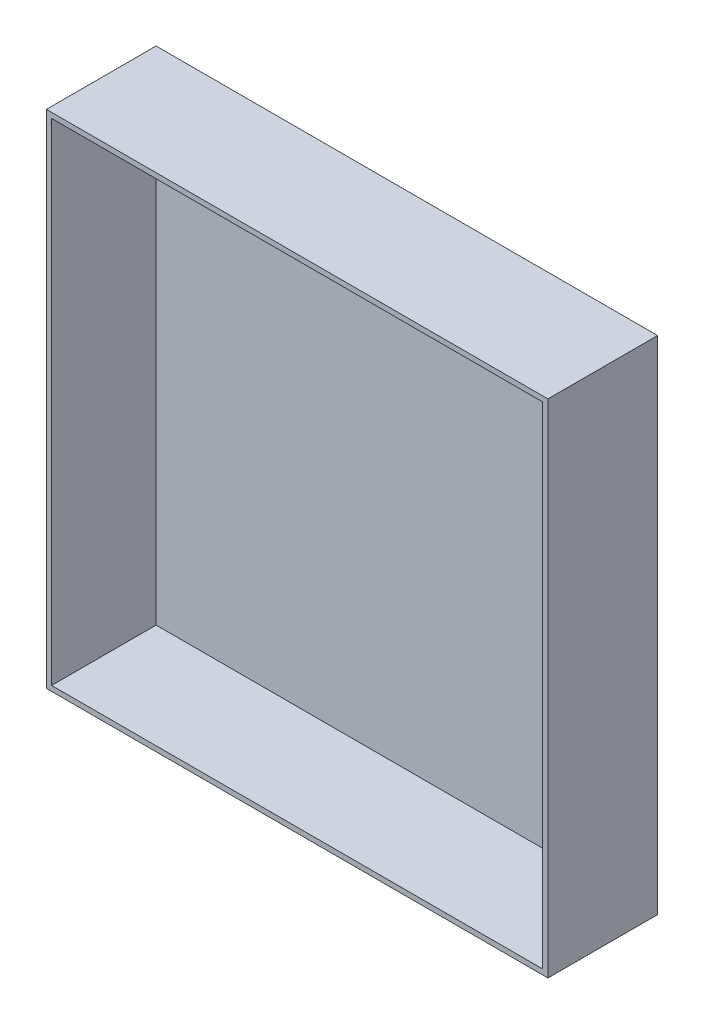
ISO-10303-21;
HEADER;
FILE_DESCRIPTION(('STEP AP214'),'2;1');
FILE_NAME('part.step','',(''),(''),'','','');
FILE_SCHEMA(('AUTOMOTIVE_DESIGN { 1 0 10303 214 1 1 1 1 }'));
ENDSEC;
DATA;
#1=APPLICATION_CONTEXT('core data for automotive mechanical design processes');
#2=APPLICATION_PROTOCOL_DEFINITION('international standard','automotive_design',2000,#1);
#3=PRODUCT_CONTEXT('',#1,'mechanical');
#4=PRODUCT('Part','Part','',(#3));
#5=PRODUCT_RELATED_PRODUCT_CATEGORY('part','',(#4));
#6=PRODUCT_DEFINITION_FORMATION('','',#4);
#7=PRODUCT_DEFINITION_CONTEXT('part definition',#1,'design');
#8=PRODUCT_DEFINITION('design','',#6,#7);
#9=PRODUCT_DEFINITION_SHAPE('','',#8);
#10=(LENGTH_UNIT() NAMED_UNIT(*) SI_UNIT(.MILLI.,.METRE.));
#11=(NAMED_UNIT(*) PLANE_ANGLE_UNIT() SI_UNIT($,.RADIAN.));
#12=(NAMED_UNIT(*) SI_UNIT($,.STERADIAN.) SOLID_ANGLE_UNIT());
#13=UNCERTAINTY_MEASURE_WITH_UNIT(LENGTH_MEASURE(1.E-05),#10,'distance_accuracy_value','');
#14=(GEOMETRIC_REPRESENTATION_CONTEXT(3) GLOBAL_UNCERTAINTY_ASSIGNED_CONTEXT((#13)) GLOBAL_UNIT_ASSIGNED_CONTEXT((#10,
#11,#12)) REPRESENTATION_CONTEXT('',''));
#15=CARTESIAN_POINT('',(0.,0.,0.));
#16=DIRECTION('',(0.,0.,1.));
#17=DIRECTION('',(1.,0.,0.));
#18=AXIS2_PLACEMENT_3D('',#15,#16,#17);
#19=CARTESIAN_POINT('',(0.,0.,3.175));
#20=DIRECTION('',(1.,0.,0.));
#21=DIRECTION('',(0.,1.,0.));
#22=AXIS2_PLACEMENT_3D('',#19,#20,#21);
#23=PLANE('',#22);
#24=DIRECTION('',(0.,-1.,0.));
#25=VECTOR('',#24,1.);
#26=CARTESIAN_POINT('',(0.,0.,0.));
#27=LINE('',#26,#25);
#28=CARTESIAN_POINT('',(-1.66533453693773E-13,304.8,0.));
#29=VERTEX_POINT('',#28);
#30=CARTESIAN_POINT('',(0.,0.,0.));
#31=VERTEX_POINT('',#30);
#32=EDGE_CURVE('E153',#29,#31,#27,.T.);
#33=ORIENTED_EDGE('',*,*,#32,.T.);
#34=DIRECTION('',(0.,0.,-1.));
#35=VECTOR('',#34,1.);
#36=CARTESIAN_POINT('',(0.,0.,3.175));
#37=LINE('',#36,#35);
#38=CARTESIAN_POINT('',(0.,0.,66.675));
#39=VERTEX_POINT('',#38);
#40=EDGE_CURVE('E11',#39,#31,#37,.T.);
#41=ORIENTED_EDGE('',*,*,#40,.F.);
#42=DIRECTION('',(0.,-1.,0.));
#43=VECTOR('',#42,1.);
#44=CARTESIAN_POINT('',(0.,0.,66.675));
#45=LINE('',#44,#43);
#46=CARTESIAN_POINT('',(-1.66533453693773E-13,304.8,66.675));
#47=VERTEX_POINT('',#46);
#48=EDGE_CURVE('E109',#47,#39,#45,.T.);
#49=ORIENTED_EDGE('',*,*,#48,.F.);
#50=DIRECTION('',(0.,0.,-1.));
#51=VECTOR('',#50,1.);
#52=CARTESIAN_POINT('',(-1.66533453693773E-13,304.8,3.175));
#53=LINE('',#52,#51);
#54=EDGE_CURVE('E98',#47,#29,#53,.T.);
#55=ORIENTED_EDGE('',*,*,#54,.T.);
#56=EDGE_LOOP('',(#33,#41,#49,#55));
#57=FACE_BOUND('',#56,.T.);
#58=ADVANCED_FACE('F35',(#57),#23,.F.);
#59=CARTESIAN_POINT('',(0.,0.,3.175));
#60=DIRECTION('',(0.,1.,0.));
#61=DIRECTION('',(0.,0.,1.));
#62=AXIS2_PLACEMENT_3D('',#59,#60,#61);
#63=PLANE('',#62);
#64=DIRECTION('',(1.,0.,0.));
#65=VECTOR('',#64,1.);
#66=CARTESIAN_POINT('',(0.,0.,0.));
#67=LINE('',#66,#65);
#68=CARTESIAN_POINT('',(304.8,0.,0.));
#69=VERTEX_POINT('',#68);
#70=EDGE_CURVE('E155',#31,#69,#67,.T.);
#71=ORIENTED_EDGE('',*,*,#70,.T.);
#72=DIRECTION('',(0.,0.,-1.));
#73=VECTOR('',#72,1.);
#74=CARTESIAN_POINT('',(304.8,0.,3.175));
#75=LINE('',#74,#73);
#76=CARTESIAN_POINT('',(304.8,0.,66.675));
#77=VERTEX_POINT('',#76);
#78=EDGE_CURVE('E42',#77,#69,#75,.T.);
#79=ORIENTED_EDGE('',*,*,#78,.F.);
#80=DIRECTION('',(1.,0.,0.));
#81=VECTOR('',#80,1.);
#82=CARTESIAN_POINT('',(0.,0.,66.675));
#83=LINE('',#82,#81);
#84=EDGE_CURVE('E113',#39,#77,#83,.T.);
#85=ORIENTED_EDGE('',*,*,#84,.F.);
#86=ORIENTED_EDGE('',*,*,#40,.T.);
#87=EDGE_LOOP('',(#71,#79,#85,#86));
#88=FACE_BOUND('',#87,.T.);
#89=ADVANCED_FACE('F167',(#88),#63,.F.);
#90=CARTESIAN_POINT('',(304.8,0.,3.175));
#91=DIRECTION('',(-1.,0.,0.));
#92=DIRECTION('',(0.,-1.,0.));
#93=AXIS2_PLACEMENT_3D('',#90,#91,#92);
#94=PLANE('',#93);
#95=DIRECTION('',(0.,1.,0.));
#96=VECTOR('',#95,1.);
#97=CARTESIAN_POINT('',(304.8,0.,0.));
#98=LINE('',#97,#96);
#99=CARTESIAN_POINT('',(304.8,304.8,0.));
#100=VERTEX_POINT('',#99);
#101=EDGE_CURVE('E157',#69,#100,#98,.T.);
#102=ORIENTED_EDGE('',*,*,#101,.T.);
#103=DIRECTION('',(0.,0.,-1.));
#104=VECTOR('',#103,1.);
#105=CARTESIAN_POINT('',(304.8,304.8,3.175));
#106=LINE('',#105,#104);
#107=CARTESIAN_POINT('',(304.8,304.8,66.675));
#108=VERTEX_POINT('',#107);
#109=EDGE_CURVE('E106',#108,#100,#106,.T.);
#110=ORIENTED_EDGE('',*,*,#109,.F.);
#111=DIRECTION('',(0.,1.,0.));
#112=VECTOR('',#111,1.);
#113=CARTESIAN_POINT('',(304.8,1.11022302462516E-13,66.675));
#114=LINE('',#113,#112);
#115=EDGE_CURVE('E119',#77,#108,#114,.T.);
#116=ORIENTED_EDGE('',*,*,#115,.F.);
#117=ORIENTED_EDGE('',*,*,#78,.T.);
#118=EDGE_LOOP('',(#102,#110,#116,#117));
#119=FACE_BOUND('',#118,.T.);
#120=ADVANCED_FACE('F163',(#119),#94,.F.);
#121=CARTESIAN_POINT('',(-1.66533453693773E-13,304.8,3.175));
#122=DIRECTION('',(0.,-1.,0.));
#123=DIRECTION('',(0.,0.,-1.));
#124=AXIS2_PLACEMENT_3D('',#121,#122,#123);
#125=PLANE('',#124);
#126=DIRECTION('',(-1.,0.,0.));
#127=VECTOR('',#126,1.);
#128=CARTESIAN_POINT('',(-1.66533453693773E-13,304.8,0.));
#129=LINE('',#128,#127);
#130=EDGE_CURVE('E57',#100,#29,#129,.T.);
#131=ORIENTED_EDGE('',*,*,#130,.T.);
#132=ORIENTED_EDGE('',*,*,#54,.F.);
#133=DIRECTION('',(-1.,0.,0.));
#134=VECTOR('',#133,1.);
#135=CARTESIAN_POINT('',(0.,304.8,66.675));
#136=LINE('',#135,#134);
#137=EDGE_CURVE('E102',#108,#47,#136,.T.);
#138=ORIENTED_EDGE('',*,*,#137,.F.);
#139=ORIENTED_EDGE('',*,*,#109,.T.);
#140=EDGE_LOOP('',(#131,#132,#138,#139));
#141=FACE_BOUND('',#140,.T.);
#142=ADVANCED_FACE('F100',(#141),#125,.F.);
#143=CARTESIAN_POINT('',(0.,0.,0.));
#144=DIRECTION('',(0.,0.,-1.));
#145=DIRECTION('',(-1.,0.,0.));
#146=AXIS2_PLACEMENT_3D('',#143,#144,#145);
#147=PLANE('',#146);
#148=ORIENTED_EDGE('',*,*,#32,.F.);
#149=ORIENTED_EDGE('',*,*,#130,.F.);
#150=ORIENTED_EDGE('',*,*,#101,.F.);
#151=ORIENTED_EDGE('',*,*,#70,.F.);
#152=EDGE_LOOP('',(#148,#149,#150,#151));
#153=FACE_BOUND('',#152,.T.);
#154=ADVANCED_FACE('F166',(#153),#147,.T.);
#155=CARTESIAN_POINT('',(0.,3.17499999999995,66.675));
#156=DIRECTION('',(0.,1.,0.));
#157=DIRECTION('',(-1.,0.,0.));
#158=AXIS2_PLACEMENT_3D('',#155,#156,#157);
#159=PLANE('',#158);
#160=DIRECTION('',(1.,0.,0.));
#161=VECTOR('',#160,1.);
#162=CARTESIAN_POINT('',(0.,3.17499999999995,3.175));
#163=LINE('',#162,#161);
#164=CARTESIAN_POINT('',(3.175,3.17499999999995,3.175));
#165=VERTEX_POINT('',#164);
#166=CARTESIAN_POINT('',(301.625,3.17499999999995,3.175));
#167=VERTEX_POINT('',#166);
#168=EDGE_CURVE('E139',#165,#167,#163,.T.);
#169=ORIENTED_EDGE('',*,*,#168,.F.);
#170=DIRECTION('',(0.,0.,-1.));
#171=VECTOR('',#170,1.);
#172=CARTESIAN_POINT('',(3.175,3.17499999999995,66.675));
#173=LINE('',#172,#171);
#174=CARTESIAN_POINT('',(3.175,3.17499999999995,66.675));
#175=VERTEX_POINT('',#174);
#176=EDGE_CURVE('E151',#175,#165,#173,.T.);
#177=ORIENTED_EDGE('',*,*,#176,.F.);
#178=DIRECTION('',(1.,0.,0.));
#179=VECTOR('',#178,1.);
#180=CARTESIAN_POINT('',(0.,3.17499999999995,66.675));
#181=LINE('',#180,#179);
#182=CARTESIAN_POINT('',(301.625,3.17499999999995,66.675));
#183=VERTEX_POINT('',#182);
#184=EDGE_CURVE('E127',#175,#183,#181,.T.);
#185=ORIENTED_EDGE('',*,*,#184,.T.);
#186=DIRECTION('',(0.,0.,-1.));
#187=VECTOR('',#186,1.);
#188=CARTESIAN_POINT('',(301.625,3.17499999999995,66.675));
#189=LINE('',#188,#187);
#190=EDGE_CURVE('E138',#183,#167,#189,.T.);
#191=ORIENTED_EDGE('',*,*,#190,.T.);
#192=EDGE_LOOP('',(#169,#177,#185,#191));
#193=FACE_BOUND('',#192,.T.);
#194=ADVANCED_FACE('F179',(#193),#159,.T.);
#195=CARTESIAN_POINT('',(3.175,0.,66.675));
#196=DIRECTION('',(-1.,0.,0.));
#197=DIRECTION('',(0.,-1.,0.));
#198=AXIS2_PLACEMENT_3D('',#195,#196,#197);
#199=PLANE('',#198);
#200=DIRECTION('',(0.,1.,0.));
#201=VECTOR('',#200,1.);
#202=CARTESIAN_POINT('',(3.175,0.,3.175));
#203=LINE('',#202,#201);
#204=CARTESIAN_POINT('',(3.17499999999998,301.625,3.175));
#205=VERTEX_POINT('',#204);
#206=EDGE_CURVE('E142',#165,#205,#203,.T.);
#207=ORIENTED_EDGE('',*,*,#206,.T.);
#208=DIRECTION('',(0.,0.,-1.));
#209=VECTOR('',#208,1.);
#210=CARTESIAN_POINT('',(3.17499999999998,301.625,66.675));
#211=LINE('',#210,#209);
#212=CARTESIAN_POINT('',(3.17499999999998,301.625,66.675));
#213=VERTEX_POINT('',#212);
#214=EDGE_CURVE('E149',#213,#205,#211,.T.);
#215=ORIENTED_EDGE('',*,*,#214,.F.);
#216=DIRECTION('',(0.,1.,0.));
#217=VECTOR('',#216,1.);
#218=CARTESIAN_POINT('',(3.175,0.,66.675));
#219=LINE('',#218,#217);
#220=EDGE_CURVE('E130',#175,#213,#219,.T.);
#221=ORIENTED_EDGE('',*,*,#220,.F.);
#222=ORIENTED_EDGE('',*,*,#176,.T.);
#223=EDGE_LOOP('',(#207,#215,#221,#222));
#224=FACE_BOUND('',#223,.T.);
#225=ADVANCED_FACE('F186',(#224),#199,.F.);
#226=CARTESIAN_POINT('',(0.,301.625,66.675));
#227=DIRECTION('',(0.,-1.,0.));
#228=DIRECTION('',(1.,0.,0.));
#229=AXIS2_PLACEMENT_3D('',#226,#227,#228);
#230=PLANE('',#229);
#231=DIRECTION('',(-1.,0.,0.));
#232=VECTOR('',#231,1.);
#233=CARTESIAN_POINT('',(0.,301.625,3.175));
#234=LINE('',#233,#232);
#235=CARTESIAN_POINT('',(301.625,301.625,3.175));
#236=VERTEX_POINT('',#235);
#237=EDGE_CURVE('E49',#236,#205,#234,.T.);
#238=ORIENTED_EDGE('',*,*,#237,.F.);
#239=DIRECTION('',(0.,0.,-1.));
#240=VECTOR('',#239,1.);
#241=CARTESIAN_POINT('',(301.625,301.625,66.675));
#242=LINE('',#241,#240);
#243=CARTESIAN_POINT('',(301.625,301.625,66.675));
#244=VERTEX_POINT('',#243);
#245=EDGE_CURVE('E147',#244,#236,#242,.T.);
#246=ORIENTED_EDGE('',*,*,#245,.F.);
#247=DIRECTION('',(-1.,0.,0.));
#248=VECTOR('',#247,1.);
#249=CARTESIAN_POINT('',(0.,301.625,66.675));
#250=LINE('',#249,#248);
#251=EDGE_CURVE('E132',#244,#213,#250,.T.);
#252=ORIENTED_EDGE('',*,*,#251,.T.);
#253=ORIENTED_EDGE('',*,*,#214,.T.);
#254=EDGE_LOOP('',(#238,#246,#252,#253));
#255=FACE_BOUND('',#254,.T.);
#256=ADVANCED_FACE('F190',(#255),#230,.T.);
#257=CARTESIAN_POINT('',(301.625,0.,66.675));
#258=DIRECTION('',(-1.,0.,0.));
#259=DIRECTION('',(0.,0.,1.));
#260=AXIS2_PLACEMENT_3D('',#257,#258,#259);
#261=PLANE('',#260);
#262=DIRECTION('',(0.,1.,0.));
#263=VECTOR('',#262,1.);
#264=CARTESIAN_POINT('',(301.625,0.,3.175));
#265=LINE('',#264,#263);
#266=EDGE_CURVE('E120',#167,#236,#265,.T.);
#267=ORIENTED_EDGE('',*,*,#266,.F.);
#268=ORIENTED_EDGE('',*,*,#190,.F.);
#269=DIRECTION('',(0.,1.,0.));
#270=VECTOR('',#269,1.);
#271=CARTESIAN_POINT('',(301.625,0.,66.675));
#272=LINE('',#271,#270);
#273=EDGE_CURVE('E135',#183,#244,#272,.T.);
#274=ORIENTED_EDGE('',*,*,#273,.T.);
#275=ORIENTED_EDGE('',*,*,#245,.T.);
#276=EDGE_LOOP('',(#267,#268,#274,#275));
#277=FACE_BOUND('',#276,.T.);
#278=ADVANCED_FACE('F194',(#277),#261,.T.);
#279=CARTESIAN_POINT('',(0.,0.,66.675));
#280=DIRECTION('',(0.,0.,1.));
#281=DIRECTION('',(1.,0.,0.));
#282=AXIS2_PLACEMENT_3D('',#279,#280,#281);
#283=PLANE('',#282);
#284=ORIENTED_EDGE('',*,*,#137,.T.);
#285=ORIENTED_EDGE('',*,*,#48,.T.);
#286=ORIENTED_EDGE('',*,*,#84,.T.);
#287=ORIENTED_EDGE('',*,*,#115,.T.);
#288=EDGE_LOOP('',(#284,#285,#286,#287));
#289=FACE_BOUND('',#288,.T.);
#290=ORIENTED_EDGE('',*,*,#184,.F.);
#291=ORIENTED_EDGE('',*,*,#220,.T.);
#292=ORIENTED_EDGE('',*,*,#251,.F.);
#293=ORIENTED_EDGE('',*,*,#273,.F.);
#294=EDGE_LOOP('',(#290,#291,#292,#293));
#295=FACE_BOUND('',#294,.T.);
#296=ADVANCED_FACE('F116',(#289,#295),#283,.T.);
#297=CARTESIAN_POINT('',(0.,0.,3.175));
#298=DIRECTION('',(0.,0.,-1.));
#299=DIRECTION('',(-1.,0.,0.));
#300=AXIS2_PLACEMENT_3D('',#297,#298,#299);
#301=PLANE('',#300);
#302=ORIENTED_EDGE('',*,*,#206,.F.);
#303=ORIENTED_EDGE('',*,*,#168,.T.);
#304=ORIENTED_EDGE('',*,*,#266,.T.);
#305=ORIENTED_EDGE('',*,*,#237,.T.);
#306=EDGE_LOOP('',(#302,#303,#304,#305));
#307=FACE_BOUND('',#306,.T.);
#308=ADVANCED_FACE('F180',(#307),#301,.F.);
#309=CLOSED_SHELL('',(#58,#89,#120,#142,#154,#194,#225,#256,#278,#296,#308));
#310=MANIFOLD_SOLID_BREP('B2',#309);
#311=ADVANCED_BREP_SHAPE_REPRESENTATION('',(#18,#310),#14);
#312=SHAPE_DEFINITION_REPRESENTATION(#9,#311);
ENDSEC;
END-ISO-10303-21;
